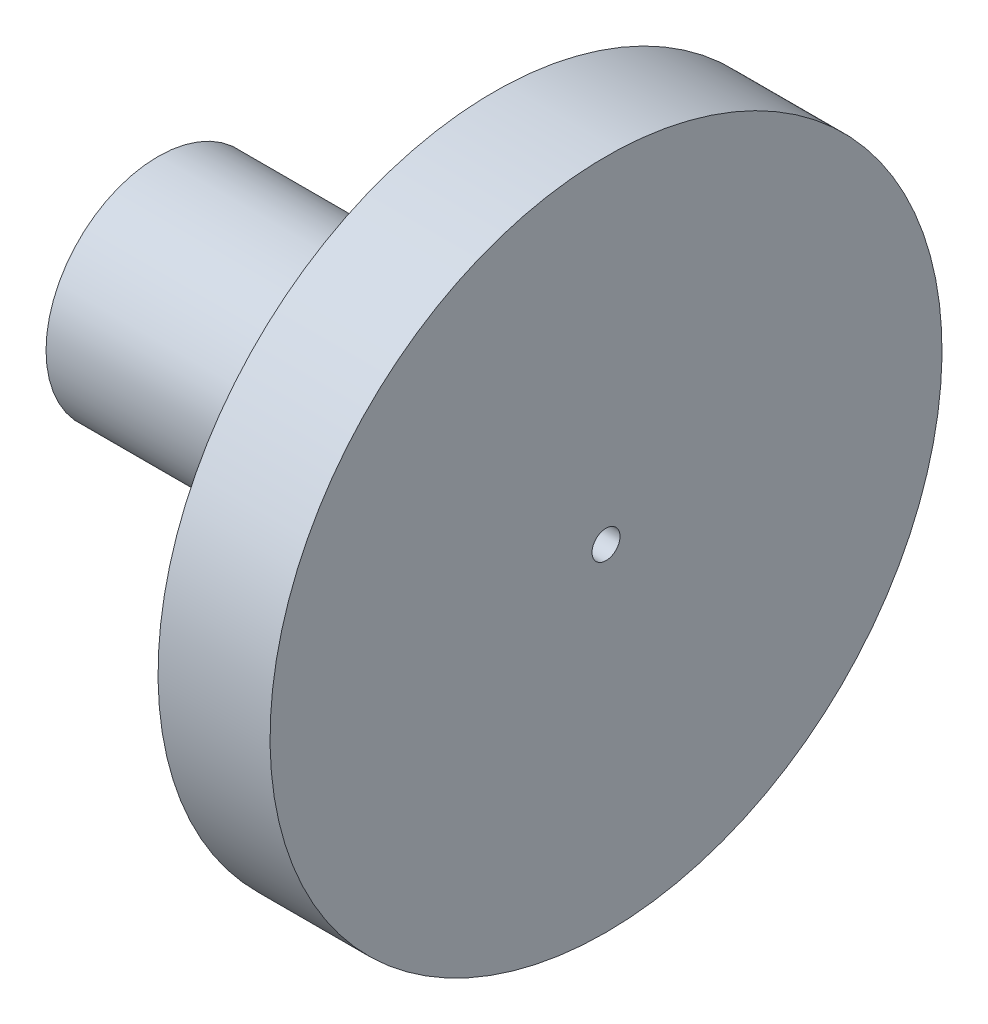
ISO-10303-21;
HEADER;
FILE_DESCRIPTION(('STEP AP214'),'2;1');
FILE_NAME('part.step','',(''),(''),'','','');
FILE_SCHEMA(('AUTOMOTIVE_DESIGN { 1 0 10303 214 1 1 1 1 }'));
ENDSEC;
DATA;
#1=APPLICATION_CONTEXT('core data for automotive mechanical design processes');
#2=APPLICATION_PROTOCOL_DEFINITION('international standard','automotive_design',2000,#1);
#3=PRODUCT_CONTEXT('',#1,'mechanical');
#4=PRODUCT('Part','Part','',(#3));
#5=PRODUCT_RELATED_PRODUCT_CATEGORY('part','',(#4));
#6=PRODUCT_DEFINITION_FORMATION('','',#4);
#7=PRODUCT_DEFINITION_CONTEXT('part definition',#1,'design');
#8=PRODUCT_DEFINITION('design','',#6,#7);
#9=PRODUCT_DEFINITION_SHAPE('','',#8);
#10=(LENGTH_UNIT() NAMED_UNIT(*) SI_UNIT(.MILLI.,.METRE.));
#11=(NAMED_UNIT(*) PLANE_ANGLE_UNIT() SI_UNIT($,.RADIAN.));
#12=(NAMED_UNIT(*) SI_UNIT($,.STERADIAN.) SOLID_ANGLE_UNIT());
#13=UNCERTAINTY_MEASURE_WITH_UNIT(LENGTH_MEASURE(1.E-05),#10,'distance_accuracy_value','');
#14=(GEOMETRIC_REPRESENTATION_CONTEXT(3) GLOBAL_UNCERTAINTY_ASSIGNED_CONTEXT((#13)) GLOBAL_UNIT_ASSIGNED_CONTEXT((#10,
#11,#12)) REPRESENTATION_CONTEXT('',''));
#15=CARTESIAN_POINT('',(0.,0.,0.));
#16=DIRECTION('',(0.,0.,1.));
#17=DIRECTION('',(1.,0.,0.));
#18=AXIS2_PLACEMENT_3D('',#15,#16,#17);
#19=CARTESIAN_POINT('',(36.,0.,0.));
#20=DIRECTION('',(-1.,0.,0.));
#21=DIRECTION('',(0.,-1.,0.));
#22=AXIS2_PLACEMENT_3D('',#19,#20,#21);
#23=PLANE('',#22);
#24=CARTESIAN_POINT('',(36.,0.,0.));
#25=DIRECTION('',(-1.,0.,0.));
#26=DIRECTION('',(0.,-1.,0.));
#27=AXIS2_PLACEMENT_3D('',#24,#25,#26);
#28=CIRCLE('',#27,4.);
#29=CARTESIAN_POINT('',(36.,-4.,0.));
#30=VERTEX_POINT('',#29);
#31=EDGE_CURVE('E63',#30,#30,#28,.T.);
#32=ORIENTED_EDGE('',*,*,#31,.T.);
#33=EDGE_LOOP('',(#32));
#34=FACE_BOUND('',#33,.T.);
#35=CARTESIAN_POINT('',(36.,0.,0.));
#36=DIRECTION('',(-1.,0.,0.));
#37=DIRECTION('',(0.,-1.,0.));
#38=AXIS2_PLACEMENT_3D('',#35,#36,#37);
#39=CIRCLE('',#38,1.25);
#40=CARTESIAN_POINT('',(36.,-1.25,0.));
#41=VERTEX_POINT('',#40);
#42=EDGE_CURVE('E10',#41,#41,#39,.T.);
#43=ORIENTED_EDGE('',*,*,#42,.F.);
#44=EDGE_LOOP('',(#43));
#45=FACE_BOUND('',#44,.T.);
#46=ADVANCED_FACE('F35',(#34,#45),#23,.T.);
#47=CARTESIAN_POINT('',(5.,0.,0.));
#48=DIRECTION('',(-1.,0.,0.));
#49=DIRECTION('',(0.,-1.,0.));
#50=AXIS2_PLACEMENT_3D('',#47,#48,#49);
#51=CYLINDRICAL_SURFACE('',#50,1.25);
#52=CARTESIAN_POINT('',(45.,0.,0.));
#53=DIRECTION('',(-1.,0.,0.));
#54=DIRECTION('',(0.,-1.,0.));
#55=AXIS2_PLACEMENT_3D('',#52,#53,#54);
#56=CIRCLE('',#55,1.25);
#57=CARTESIAN_POINT('',(45.,-1.25,0.));
#58=VERTEX_POINT('',#57);
#59=EDGE_CURVE('E41',#58,#58,#56,.T.);
#60=ORIENTED_EDGE('',*,*,#59,.F.);
#61=EDGE_LOOP('',(#60));
#62=FACE_BOUND('',#61,.T.);
#63=ORIENTED_EDGE('',*,*,#42,.T.);
#64=EDGE_LOOP('',(#63));
#65=FACE_BOUND('',#64,.T.);
#66=ADVANCED_FACE('F87',(#62,#65),#51,.F.);
#67=CARTESIAN_POINT('',(45.,0.,0.));
#68=DIRECTION('',(1.,0.,0.));
#69=DIRECTION('',(0.,1.,0.));
#70=AXIS2_PLACEMENT_3D('',#67,#68,#69);
#71=PLANE('',#70);
#72=ORIENTED_EDGE('',*,*,#59,.T.);
#73=EDGE_LOOP('',(#72));
#74=FACE_BOUND('',#73,.T.);
#75=CARTESIAN_POINT('',(45.,0.,0.));
#76=DIRECTION('',(-1.,0.,0.));
#77=DIRECTION('',(0.,-1.,0.));
#78=AXIS2_PLACEMENT_3D('',#75,#76,#77);
#79=CIRCLE('',#78,30.);
#80=CARTESIAN_POINT('',(45.,-30.,0.));
#81=VERTEX_POINT('',#80);
#82=EDGE_CURVE('E45',#81,#81,#79,.T.);
#83=ORIENTED_EDGE('',*,*,#82,.F.);
#84=EDGE_LOOP('',(#83));
#85=FACE_BOUND('',#84,.T.);
#86=ADVANCED_FACE('F91',(#74,#85),#71,.T.);
#87=CARTESIAN_POINT('',(5.,0.,0.));
#88=DIRECTION('',(-1.,0.,0.));
#89=DIRECTION('',(0.,-1.,0.));
#90=AXIS2_PLACEMENT_3D('',#87,#88,#89);
#91=CYLINDRICAL_SURFACE('',#90,30.);
#92=ORIENTED_EDGE('',*,*,#82,.T.);
#93=EDGE_LOOP('',(#92));
#94=FACE_BOUND('',#93,.T.);
#95=CARTESIAN_POINT('',(35.,0.,0.));
#96=DIRECTION('',(-1.,0.,0.));
#97=DIRECTION('',(0.,-1.,0.));
#98=AXIS2_PLACEMENT_3D('',#95,#96,#97);
#99=CIRCLE('',#98,30.);
#100=CARTESIAN_POINT('',(35.,-30.,0.));
#101=VERTEX_POINT('',#100);
#102=EDGE_CURVE('E49',#101,#101,#99,.T.);
#103=ORIENTED_EDGE('',*,*,#102,.F.);
#104=EDGE_LOOP('',(#103));
#105=FACE_BOUND('',#104,.T.);
#106=ADVANCED_FACE('F96',(#94,#105),#91,.T.);
#107=CARTESIAN_POINT('',(35.,0.,0.));
#108=DIRECTION('',(-1.,0.,0.));
#109=DIRECTION('',(0.,-1.,0.));
#110=AXIS2_PLACEMENT_3D('',#107,#108,#109);
#111=PLANE('',#110);
#112=ORIENTED_EDGE('',*,*,#102,.T.);
#113=EDGE_LOOP('',(#112));
#114=FACE_BOUND('',#113,.T.);
#115=CARTESIAN_POINT('',(35.,0.,0.));
#116=DIRECTION('',(-1.,0.,0.));
#117=DIRECTION('',(0.,-1.,0.));
#118=AXIS2_PLACEMENT_3D('',#115,#116,#117);
#119=CIRCLE('',#118,10.);
#120=CARTESIAN_POINT('',(35.,-10.,0.));
#121=VERTEX_POINT('',#120);
#122=EDGE_CURVE('E54',#121,#121,#119,.T.);
#123=ORIENTED_EDGE('',*,*,#122,.F.);
#124=EDGE_LOOP('',(#123));
#125=FACE_BOUND('',#124,.T.);
#126=ADVANCED_FACE('F83',(#114,#125),#111,.T.);
#127=CARTESIAN_POINT('',(5.,0.,0.));
#128=DIRECTION('',(-1.,0.,0.));
#129=DIRECTION('',(0.,-1.,0.));
#130=AXIS2_PLACEMENT_3D('',#127,#128,#129);
#131=CYLINDRICAL_SURFACE('',#130,10.);
#132=ORIENTED_EDGE('',*,*,#122,.T.);
#133=EDGE_LOOP('',(#132));
#134=FACE_BOUND('',#133,.T.);
#135=CARTESIAN_POINT('',(5.00000000000001,0.,0.));
#136=DIRECTION('',(-1.,0.,0.));
#137=DIRECTION('',(0.,-1.,0.));
#138=AXIS2_PLACEMENT_3D('',#135,#136,#137);
#139=CIRCLE('',#138,10.);
#140=CARTESIAN_POINT('',(5.00000000000001,-10.,0.));
#141=VERTEX_POINT('',#140);
#142=EDGE_CURVE('E57',#141,#141,#139,.T.);
#143=ORIENTED_EDGE('',*,*,#142,.F.);
#144=EDGE_LOOP('',(#143));
#145=FACE_BOUND('',#144,.T.);
#146=ADVANCED_FACE('F77',(#134,#145),#131,.T.);
#147=CARTESIAN_POINT('',(5.00000000000001,0.,0.));
#148=DIRECTION('',(-1.,0.,0.));
#149=DIRECTION('',(0.,-1.,0.));
#150=AXIS2_PLACEMENT_3D('',#147,#148,#149);
#151=PLANE('',#150);
#152=ORIENTED_EDGE('',*,*,#142,.T.);
#153=EDGE_LOOP('',(#152));
#154=FACE_BOUND('',#153,.T.);
#155=CARTESIAN_POINT('',(5.,0.,0.));
#156=DIRECTION('',(-1.,0.,0.));
#157=DIRECTION('',(0.,-1.,0.));
#158=AXIS2_PLACEMENT_3D('',#155,#156,#157);
#159=CIRCLE('',#158,4.);
#160=CARTESIAN_POINT('',(5.,-4.,0.));
#161=VERTEX_POINT('',#160);
#162=EDGE_CURVE('E60',#161,#161,#159,.T.);
#163=ORIENTED_EDGE('',*,*,#162,.F.);
#164=EDGE_LOOP('',(#163));
#165=FACE_BOUND('',#164,.T.);
#166=ADVANCED_FACE('F72',(#154,#165),#151,.T.);
#167=CARTESIAN_POINT('',(5.,0.,0.));
#168=DIRECTION('',(-1.,0.,0.));
#169=DIRECTION('',(0.,-1.,0.));
#170=AXIS2_PLACEMENT_3D('',#167,#168,#169);
#171=CYLINDRICAL_SURFACE('',#170,4.);
#172=ORIENTED_EDGE('',*,*,#31,.F.);
#173=EDGE_LOOP('',(#172));
#174=FACE_BOUND('',#173,.T.);
#175=ORIENTED_EDGE('',*,*,#162,.T.);
#176=EDGE_LOOP('',(#175));
#177=FACE_BOUND('',#176,.T.);
#178=ADVANCED_FACE('F69',(#174,#177),#171,.F.);
#179=CLOSED_SHELL('',(#46,#66,#86,#106,#126,#146,#166,#178));
#180=MANIFOLD_SOLID_BREP('B2',#179);
#181=ADVANCED_BREP_SHAPE_REPRESENTATION('',(#18,#180),#14);
#182=SHAPE_DEFINITION_REPRESENTATION(#9,#181);
ENDSEC;
END-ISO-10303-21;
